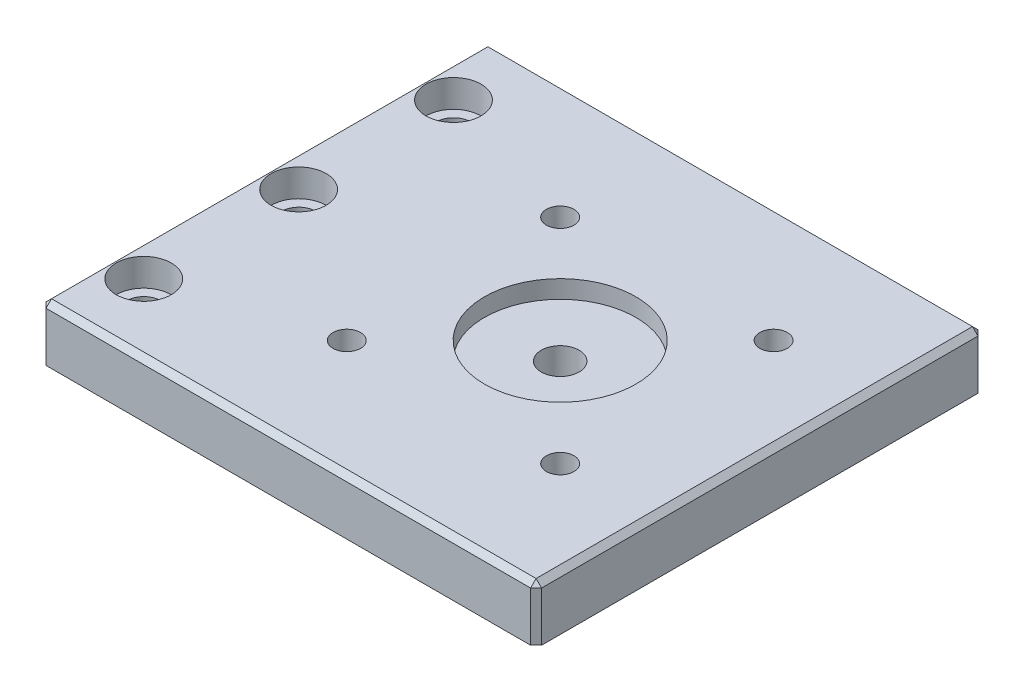
ISO-10303-21;
HEADER;
FILE_DESCRIPTION(('STEP AP214'),'2;1');
FILE_NAME('part.step','',(''),(''),'','','');
FILE_SCHEMA(('AUTOMOTIVE_DESIGN { 1 0 10303 214 1 1 1 1 }'));
ENDSEC;
DATA;
#1=APPLICATION_CONTEXT('core data for automotive mechanical design processes');
#2=APPLICATION_PROTOCOL_DEFINITION('international standard','automotive_design',2000,#1);
#3=PRODUCT_CONTEXT('',#1,'mechanical');
#4=PRODUCT('Part','Part','',(#3));
#5=PRODUCT_RELATED_PRODUCT_CATEGORY('part','',(#4));
#6=PRODUCT_DEFINITION_FORMATION('','',#4);
#7=PRODUCT_DEFINITION_CONTEXT('part definition',#1,'design');
#8=PRODUCT_DEFINITION('design','',#6,#7);
#9=PRODUCT_DEFINITION_SHAPE('','',#8);
#10=(LENGTH_UNIT() NAMED_UNIT(*) SI_UNIT(.MILLI.,.METRE.));
#11=(NAMED_UNIT(*) PLANE_ANGLE_UNIT() SI_UNIT($,.RADIAN.));
#12=(NAMED_UNIT(*) SI_UNIT($,.STERADIAN.) SOLID_ANGLE_UNIT());
#13=UNCERTAINTY_MEASURE_WITH_UNIT(LENGTH_MEASURE(1.E-05),#10,'distance_accuracy_value','');
#14=(GEOMETRIC_REPRESENTATION_CONTEXT(3) GLOBAL_UNCERTAINTY_ASSIGNED_CONTEXT((#13)) GLOBAL_UNIT_ASSIGNED_CONTEXT((#10,
#11,#12)) REPRESENTATION_CONTEXT('',''));
#15=CARTESIAN_POINT('',(0.,0.,0.));
#16=DIRECTION('',(0.,0.,1.));
#17=DIRECTION('',(1.,0.,0.));
#18=AXIS2_PLACEMENT_3D('',#15,#16,#17);
#19=CARTESIAN_POINT('',(36.,4.,-32.5));
#20=DIRECTION('',(-1.,0.,0.));
#21=DIRECTION('',(0.,0.,1.));
#22=AXIS2_PLACEMENT_3D('',#19,#20,#21);
#23=PLANE('',#22);
#24=DIRECTION('',(0.,0.,-1.));
#25=VECTOR('',#24,1.);
#26=CARTESIAN_POINT('',(36.,-4.,-32.5));
#27=LINE('',#26,#25);
#28=CARTESIAN_POINT('',(36.,-4.,31.7));
#29=VERTEX_POINT('',#28);
#30=CARTESIAN_POINT('',(36.,-4.,-31.7));
#31=VERTEX_POINT('',#30);
#32=EDGE_CURVE('E163',#29,#31,#27,.T.);
#33=ORIENTED_EDGE('',*,*,#32,.T.);
#34=DIRECTION('',(0.,1.,0.));
#35=VECTOR('',#34,1.);
#36=CARTESIAN_POINT('',(36.,4.,-31.7));
#37=LINE('',#36,#35);
#38=CARTESIAN_POINT('',(36.,3.19999999999999,-31.7));
#39=VERTEX_POINT('',#38);
#40=EDGE_CURVE('E238',#31,#39,#37,.T.);
#41=ORIENTED_EDGE('',*,*,#40,.T.);
#42=DIRECTION('',(0.,0.,1.));
#43=VECTOR('',#42,1.);
#44=CARTESIAN_POINT('',(36.,3.19999999999999,32.5));
#45=LINE('',#44,#43);
#46=CARTESIAN_POINT('',(36.,3.19999999999999,31.7));
#47=VERTEX_POINT('',#46);
#48=EDGE_CURVE('E232',#39,#47,#45,.T.);
#49=ORIENTED_EDGE('',*,*,#48,.T.);
#50=DIRECTION('',(0.,-1.,0.));
#51=VECTOR('',#50,1.);
#52=CARTESIAN_POINT('',(36.,4.,31.7));
#53=LINE('',#52,#51);
#54=EDGE_CURVE('E235',#47,#29,#53,.T.);
#55=ORIENTED_EDGE('',*,*,#54,.T.);
#56=EDGE_LOOP('',(#33,#41,#49,#55));
#57=FACE_BOUND('',#56,.T.);
#58=ADVANCED_FACE('F47',(#57),#23,.F.);
#59=CARTESIAN_POINT('',(-36.,4.,-32.5));
#60=DIRECTION('',(0.,0.,1.));
#61=DIRECTION('',(1.,0.,0.));
#62=AXIS2_PLACEMENT_3D('',#59,#60,#61);
#63=PLANE('',#62);
#64=DIRECTION('',(-1.,0.,0.));
#65=VECTOR('',#64,1.);
#66=CARTESIAN_POINT('',(-36.,-4.,-32.5));
#67=LINE('',#66,#65);
#68=CARTESIAN_POINT('',(35.2,-4.,-32.5));
#69=VERTEX_POINT('',#68);
#70=CARTESIAN_POINT('',(-35.2,-4.,-32.5));
#71=VERTEX_POINT('',#70);
#72=EDGE_CURVE('E157',#69,#71,#67,.T.);
#73=ORIENTED_EDGE('',*,*,#72,.T.);
#74=DIRECTION('',(0.,1.,0.));
#75=VECTOR('',#74,1.);
#76=CARTESIAN_POINT('',(-35.2,4.,-32.5));
#77=LINE('',#76,#75);
#78=CARTESIAN_POINT('',(-35.2,3.19999999999999,-32.5));
#79=VERTEX_POINT('',#78);
#80=EDGE_CURVE('E131',#71,#79,#77,.T.);
#81=ORIENTED_EDGE('',*,*,#80,.T.);
#82=DIRECTION('',(1.,0.,0.));
#83=VECTOR('',#82,1.);
#84=CARTESIAN_POINT('',(36.,3.19999999999999,-32.5));
#85=LINE('',#84,#83);
#86=CARTESIAN_POINT('',(35.2,3.19999999999999,-32.5));
#87=VERTEX_POINT('',#86);
#88=EDGE_CURVE('E137',#79,#87,#85,.T.);
#89=ORIENTED_EDGE('',*,*,#88,.T.);
#90=DIRECTION('',(0.,-1.,0.));
#91=VECTOR('',#90,1.);
#92=CARTESIAN_POINT('',(35.2,4.,-32.5));
#93=LINE('',#92,#91);
#94=EDGE_CURVE('E227',#87,#69,#93,.T.);
#95=ORIENTED_EDGE('',*,*,#94,.T.);
#96=EDGE_LOOP('',(#73,#81,#89,#95));
#97=FACE_BOUND('',#96,.T.);
#98=ADVANCED_FACE('F430',(#97),#63,.F.);
#99=CARTESIAN_POINT('',(-36.,4.,-32.5));
#100=DIRECTION('',(1.,0.,0.));
#101=DIRECTION('',(0.,0.,-1.));
#102=AXIS2_PLACEMENT_3D('',#99,#100,#101);
#103=PLANE('',#102);
#104=DIRECTION('',(0.,0.,-1.));
#105=VECTOR('',#104,1.);
#106=CARTESIAN_POINT('',(-36.,3.19999999999999,-32.5));
#107=LINE('',#106,#105);
#108=CARTESIAN_POINT('',(-36.,3.19999999999999,31.7));
#109=VERTEX_POINT('',#108);
#110=CARTESIAN_POINT('',(-36.,3.19999999999999,-31.7));
#111=VERTEX_POINT('',#110);
#112=EDGE_CURVE('E146',#109,#111,#107,.T.);
#113=ORIENTED_EDGE('',*,*,#112,.T.);
#114=DIRECTION('',(0.,-1.,0.));
#115=VECTOR('',#114,1.);
#116=CARTESIAN_POINT('',(-36.,4.,-31.7));
#117=LINE('',#116,#115);
#118=CARTESIAN_POINT('',(-36.,-4.,-31.7));
#119=VERTEX_POINT('',#118);
#120=EDGE_CURVE('E130',#111,#119,#117,.T.);
#121=ORIENTED_EDGE('',*,*,#120,.T.);
#122=DIRECTION('',(0.,0.,1.));
#123=VECTOR('',#122,1.);
#124=CARTESIAN_POINT('',(-36.,-4.,-32.5));
#125=LINE('',#124,#123);
#126=CARTESIAN_POINT('',(-36.,-4.,31.7));
#127=VERTEX_POINT('',#126);
#128=EDGE_CURVE('E143',#119,#127,#125,.T.);
#129=ORIENTED_EDGE('',*,*,#128,.T.);
#130=DIRECTION('',(0.,1.,0.));
#131=VECTOR('',#130,1.);
#132=CARTESIAN_POINT('',(-36.,4.,31.7));
#133=LINE('',#132,#131);
#134=EDGE_CURVE('E150',#127,#109,#133,.T.);
#135=ORIENTED_EDGE('',*,*,#134,.T.);
#136=EDGE_LOOP('',(#113,#121,#129,#135));
#137=FACE_BOUND('',#136,.T.);
#138=ADVANCED_FACE('F142',(#137),#103,.F.);
#139=CARTESIAN_POINT('',(-36.,4.,32.5));
#140=DIRECTION('',(0.,0.,-1.));
#141=DIRECTION('',(-1.,0.,0.));
#142=AXIS2_PLACEMENT_3D('',#139,#140,#141);
#143=PLANE('',#142);
#144=DIRECTION('',(1.,0.,0.));
#145=VECTOR('',#144,1.);
#146=CARTESIAN_POINT('',(-36.,-4.,32.5));
#147=LINE('',#146,#145);
#148=CARTESIAN_POINT('',(-35.2,-4.,32.5));
#149=VERTEX_POINT('',#148);
#150=CARTESIAN_POINT('',(35.2,-4.,32.5));
#151=VERTEX_POINT('',#150);
#152=EDGE_CURVE('E156',#149,#151,#147,.T.);
#153=ORIENTED_EDGE('',*,*,#152,.T.);
#154=DIRECTION('',(0.,1.,0.));
#155=VECTOR('',#154,1.);
#156=CARTESIAN_POINT('',(35.2,4.,32.5));
#157=LINE('',#156,#155);
#158=CARTESIAN_POINT('',(35.2,3.19999999999999,32.5));
#159=VERTEX_POINT('',#158);
#160=EDGE_CURVE('E247',#151,#159,#157,.T.);
#161=ORIENTED_EDGE('',*,*,#160,.T.);
#162=DIRECTION('',(-1.,0.,0.));
#163=VECTOR('',#162,1.);
#164=CARTESIAN_POINT('',(-36.,3.19999999999999,32.5));
#165=LINE('',#164,#163);
#166=CARTESIAN_POINT('',(-35.2,3.19999999999999,32.5));
#167=VERTEX_POINT('',#166);
#168=EDGE_CURVE('E241',#159,#167,#165,.T.);
#169=ORIENTED_EDGE('',*,*,#168,.T.);
#170=DIRECTION('',(0.,-1.,0.));
#171=VECTOR('',#170,1.);
#172=CARTESIAN_POINT('',(-35.2,4.,32.5));
#173=LINE('',#172,#171);
#174=EDGE_CURVE('E244',#167,#149,#173,.T.);
#175=ORIENTED_EDGE('',*,*,#174,.T.);
#176=EDGE_LOOP('',(#153,#161,#169,#175));
#177=FACE_BOUND('',#176,.T.);
#178=ADVANCED_FACE('F407',(#177),#143,.F.);
#179=CARTESIAN_POINT('',(0.,4.,0.));
#180=DIRECTION('',(0.,1.,0.));
#181=DIRECTION('',(0.,0.,1.));
#182=AXIS2_PLACEMENT_3D('',#179,#180,#181);
#183=PLANE('',#182);
#184=DIRECTION('',(-1.,0.,0.));
#185=VECTOR('',#184,1.);
#186=CARTESIAN_POINT('',(-36.,4.,-31.7));
#187=LINE('',#186,#185);
#188=CARTESIAN_POINT('',(35.2,4.,-31.7));
#189=VERTEX_POINT('',#188);
#190=CARTESIAN_POINT('',(-35.2,4.,-31.7));
#191=VERTEX_POINT('',#190);
#192=EDGE_CURVE('E58',#189,#191,#187,.T.);
#193=ORIENTED_EDGE('',*,*,#192,.T.);
#194=DIRECTION('',(0.,0.,1.));
#195=VECTOR('',#194,1.);
#196=CARTESIAN_POINT('',(-35.2,4.,32.5));
#197=LINE('',#196,#195);
#198=CARTESIAN_POINT('',(-35.2,4.,31.7));
#199=VERTEX_POINT('',#198);
#200=EDGE_CURVE('E11',#191,#199,#197,.T.);
#201=ORIENTED_EDGE('',*,*,#200,.T.);
#202=DIRECTION('',(1.,0.,0.));
#203=VECTOR('',#202,1.);
#204=CARTESIAN_POINT('',(36.,4.,31.7));
#205=LINE('',#204,#203);
#206=CARTESIAN_POINT('',(35.2,4.,31.7));
#207=VERTEX_POINT('',#206);
#208=EDGE_CURVE('E250',#199,#207,#205,.T.);
#209=ORIENTED_EDGE('',*,*,#208,.T.);
#210=DIRECTION('',(0.,0.,-1.));
#211=VECTOR('',#210,1.);
#212=CARTESIAN_POINT('',(35.2,4.,-32.5));
#213=LINE('',#212,#211);
#214=EDGE_CURVE('E69',#207,#189,#213,.T.);
#215=ORIENTED_EDGE('',*,*,#214,.T.);
#216=EDGE_LOOP('',(#193,#201,#209,#215));
#217=FACE_BOUND('',#216,.T.);
#218=CARTESIAN_POINT('',(-31.,4.,-22.5));
#219=DIRECTION('',(0.,1.,0.));
#220=DIRECTION('',(0.,0.,1.));
#221=AXIS2_PLACEMENT_3D('',#218,#219,#220);
#222=CIRCLE('',#221,4.00000000000001);
#223=CARTESIAN_POINT('',(-31.,4.,-18.5));
#224=VERTEX_POINT('',#223);
#225=EDGE_CURVE('E302',#224,#224,#222,.T.);
#226=ORIENTED_EDGE('',*,*,#225,.F.);
#227=EDGE_LOOP('',(#226));
#228=FACE_BOUND('',#227,.T.);
#229=CARTESIAN_POINT('',(-31.,4.,0.));
#230=DIRECTION('',(0.,1.,0.));
#231=DIRECTION('',(0.,0.,1.));
#232=AXIS2_PLACEMENT_3D('',#229,#230,#231);
#233=CIRCLE('',#232,4.00000000000001);
#234=CARTESIAN_POINT('',(-31.,4.,4.00000000000001));
#235=VERTEX_POINT('',#234);
#236=EDGE_CURVE('E212',#235,#235,#233,.T.);
#237=ORIENTED_EDGE('',*,*,#236,.F.);
#238=EDGE_LOOP('',(#237));
#239=FACE_BOUND('',#238,.T.);
#240=CARTESIAN_POINT('',(-31.,4.,22.5));
#241=DIRECTION('',(0.,1.,0.));
#242=DIRECTION('',(0.,0.,1.));
#243=AXIS2_PLACEMENT_3D('',#240,#241,#242);
#244=CIRCLE('',#243,4.00000000000001);
#245=CARTESIAN_POINT('',(-31.,4.,26.5));
#246=VERTEX_POINT('',#245);
#247=EDGE_CURVE('E206',#246,#246,#244,.T.);
#248=ORIENTED_EDGE('',*,*,#247,.F.);
#249=EDGE_LOOP('',(#248));
#250=FACE_BOUND('',#249,.T.);
#251=CARTESIAN_POINT('',(22.5,4.,-15.5));
#252=DIRECTION('',(0.,1.,0.));
#253=DIRECTION('',(0.,0.,1.));
#254=AXIS2_PLACEMENT_3D('',#251,#252,#253);
#255=CIRCLE('',#254,2.00000000000001);
#256=CARTESIAN_POINT('',(22.5,4.,-13.5));
#257=VERTEX_POINT('',#256);
#258=EDGE_CURVE('E190',#257,#257,#255,.T.);
#259=ORIENTED_EDGE('',*,*,#258,.F.);
#260=EDGE_LOOP('',(#259));
#261=FACE_BOUND('',#260,.T.);
#262=CARTESIAN_POINT('',(-8.5,4.,-15.5));
#263=DIRECTION('',(0.,1.,0.));
#264=DIRECTION('',(0.,0.,1.));
#265=AXIS2_PLACEMENT_3D('',#262,#263,#264);
#266=CIRCLE('',#265,2.00000000000001);
#267=CARTESIAN_POINT('',(-8.5,4.,-13.5));
#268=VERTEX_POINT('',#267);
#269=EDGE_CURVE('E184',#268,#268,#266,.T.);
#270=ORIENTED_EDGE('',*,*,#269,.F.);
#271=EDGE_LOOP('',(#270));
#272=FACE_BOUND('',#271,.T.);
#273=CARTESIAN_POINT('',(-8.5,4.,15.5));
#274=DIRECTION('',(0.,1.,0.));
#275=DIRECTION('',(0.,0.,1.));
#276=AXIS2_PLACEMENT_3D('',#273,#274,#275);
#277=CIRCLE('',#276,2.00000000000001);
#278=CARTESIAN_POINT('',(-8.5,4.,17.5));
#279=VERTEX_POINT('',#278);
#280=EDGE_CURVE('E178',#279,#279,#277,.T.);
#281=ORIENTED_EDGE('',*,*,#280,.F.);
#282=EDGE_LOOP('',(#281));
#283=FACE_BOUND('',#282,.T.);
#284=CARTESIAN_POINT('',(22.5,4.,15.5));
#285=DIRECTION('',(0.,1.,0.));
#286=DIRECTION('',(0.,0.,1.));
#287=AXIS2_PLACEMENT_3D('',#284,#285,#286);
#288=CIRCLE('',#287,2.00000000000001);
#289=CARTESIAN_POINT('',(22.5,4.,17.5));
#290=VERTEX_POINT('',#289);
#291=EDGE_CURVE('E172',#290,#290,#288,.T.);
#292=ORIENTED_EDGE('',*,*,#291,.F.);
#293=EDGE_LOOP('',(#292));
#294=FACE_BOUND('',#293,.T.);
#295=CARTESIAN_POINT('',(7.,4.,0.));
#296=DIRECTION('',(0.,1.,0.));
#297=DIRECTION('',(0.,0.,1.));
#298=AXIS2_PLACEMENT_3D('',#295,#296,#297);
#299=CIRCLE('',#298,11.);
#300=CARTESIAN_POINT('',(7.,4.,11.));
#301=VERTEX_POINT('',#300);
#302=EDGE_CURVE('E176',#301,#301,#299,.T.);
#303=ORIENTED_EDGE('',*,*,#302,.F.);
#304=EDGE_LOOP('',(#303));
#305=FACE_BOUND('',#304,.T.);
#306=ADVANCED_FACE('F601',(#217,#228,#239,#250,#261,#272,#283,#294,#305),#183,.T.);
#307=CARTESIAN_POINT('',(0.,-4.,0.));
#308=DIRECTION('',(0.,1.,0.));
#309=DIRECTION('',(0.,0.,1.));
#310=AXIS2_PLACEMENT_3D('',#307,#308,#309);
#311=PLANE('',#310);
#312=CARTESIAN_POINT('',(-31.,-4.,-22.5));
#313=DIRECTION('',(0.,1.,0.));
#314=DIRECTION('',(0.,0.,1.));
#315=AXIS2_PLACEMENT_3D('',#312,#313,#314);
#316=CIRCLE('',#315,2.50000000000001);
#317=CARTESIAN_POINT('',(-31.,-4.,-20.));
#318=VERTEX_POINT('',#317);
#319=EDGE_CURVE('E208',#318,#318,#316,.T.);
#320=ORIENTED_EDGE('',*,*,#319,.T.);
#321=EDGE_LOOP('',(#320));
#322=FACE_BOUND('',#321,.T.);
#323=CARTESIAN_POINT('',(-31.,-4.,0.));
#324=DIRECTION('',(0.,1.,0.));
#325=DIRECTION('',(0.,0.,1.));
#326=AXIS2_PLACEMENT_3D('',#323,#324,#325);
#327=CIRCLE('',#326,2.50000000000001);
#328=CARTESIAN_POINT('',(-31.,-4.,2.50000000000001));
#329=VERTEX_POINT('',#328);
#330=EDGE_CURVE('E202',#329,#329,#327,.T.);
#331=ORIENTED_EDGE('',*,*,#330,.T.);
#332=EDGE_LOOP('',(#331));
#333=FACE_BOUND('',#332,.T.);
#334=CARTESIAN_POINT('',(-31.,-4.,22.5));
#335=DIRECTION('',(0.,1.,0.));
#336=DIRECTION('',(0.,0.,1.));
#337=AXIS2_PLACEMENT_3D('',#334,#335,#336);
#338=CIRCLE('',#337,2.50000000000001);
#339=CARTESIAN_POINT('',(-31.,-4.,25.));
#340=VERTEX_POINT('',#339);
#341=EDGE_CURVE('E196',#340,#340,#338,.T.);
#342=ORIENTED_EDGE('',*,*,#341,.T.);
#343=EDGE_LOOP('',(#342));
#344=FACE_BOUND('',#343,.T.);
#345=CARTESIAN_POINT('',(22.5,-4.,-15.5));
#346=DIRECTION('',(0.,-1.,0.));
#347=DIRECTION('',(0.,0.,-1.));
#348=AXIS2_PLACEMENT_3D('',#345,#346,#347);
#349=CIRCLE('',#348,3.00000000000002);
#350=CARTESIAN_POINT('',(22.5,-4.,-18.5));
#351=VERTEX_POINT('',#350);
#352=EDGE_CURVE('E200',#351,#351,#349,.T.);
#353=ORIENTED_EDGE('',*,*,#352,.F.);
#354=EDGE_LOOP('',(#353));
#355=FACE_BOUND('',#354,.T.);
#356=CARTESIAN_POINT('',(-8.5,-4.,-15.5));
#357=DIRECTION('',(0.,-1.,0.));
#358=DIRECTION('',(0.,0.,-1.));
#359=AXIS2_PLACEMENT_3D('',#356,#357,#358);
#360=CIRCLE('',#359,3.00000000000001);
#361=CARTESIAN_POINT('',(-8.5,-4.,-18.5));
#362=VERTEX_POINT('',#361);
#363=EDGE_CURVE('E194',#362,#362,#360,.T.);
#364=ORIENTED_EDGE('',*,*,#363,.F.);
#365=EDGE_LOOP('',(#364));
#366=FACE_BOUND('',#365,.T.);
#367=CARTESIAN_POINT('',(-8.5,-4.,15.5));
#368=DIRECTION('',(0.,-1.,0.));
#369=DIRECTION('',(0.,0.,-1.));
#370=AXIS2_PLACEMENT_3D('',#367,#368,#369);
#371=CIRCLE('',#370,3.00000000000001);
#372=CARTESIAN_POINT('',(-8.5,-4.,12.5));
#373=VERTEX_POINT('',#372);
#374=EDGE_CURVE('E188',#373,#373,#371,.T.);
#375=ORIENTED_EDGE('',*,*,#374,.F.);
#376=EDGE_LOOP('',(#375));
#377=FACE_BOUND('',#376,.T.);
#378=CARTESIAN_POINT('',(22.5,-4.,15.5));
#379=DIRECTION('',(0.,-1.,0.));
#380=DIRECTION('',(0.,0.,-1.));
#381=AXIS2_PLACEMENT_3D('',#378,#379,#380);
#382=CIRCLE('',#381,3.00000000000002);
#383=CARTESIAN_POINT('',(22.5,-4.,12.5));
#384=VERTEX_POINT('',#383);
#385=EDGE_CURVE('E182',#384,#384,#382,.T.);
#386=ORIENTED_EDGE('',*,*,#385,.F.);
#387=EDGE_LOOP('',(#386));
#388=FACE_BOUND('',#387,.T.);
#389=CARTESIAN_POINT('',(7.,-4.,0.));
#390=DIRECTION('',(0.,1.,0.));
#391=DIRECTION('',(0.,0.,1.));
#392=AXIS2_PLACEMENT_3D('',#389,#390,#391);
#393=CIRCLE('',#392,2.75000000000001);
#394=CARTESIAN_POINT('',(7.,-4.,2.75000000000002));
#395=VERTEX_POINT('',#394);
#396=EDGE_CURVE('E167',#395,#395,#393,.T.);
#397=ORIENTED_EDGE('',*,*,#396,.T.);
#398=EDGE_LOOP('',(#397));
#399=FACE_BOUND('',#398,.T.);
#400=ORIENTED_EDGE('',*,*,#128,.F.);
#401=DIRECTION('',(-0.707106781186548,0.,0.707106781186548));
#402=VECTOR('',#401,1.);
#403=CARTESIAN_POINT('',(-36.,-4.,-31.7));
#404=LINE('',#403,#402);
#405=EDGE_CURVE('E126',#119,#71,#404,.F.);
#406=ORIENTED_EDGE('',*,*,#405,.T.);
#407=ORIENTED_EDGE('',*,*,#72,.F.);
#408=DIRECTION('',(-0.707106781186548,0.,-0.707106781186548));
#409=VECTOR('',#408,1.);
#410=CARTESIAN_POINT('',(35.2,-4.,-32.5));
#411=LINE('',#410,#409);
#412=EDGE_CURVE('E138',#69,#31,#411,.F.);
#413=ORIENTED_EDGE('',*,*,#412,.T.);
#414=ORIENTED_EDGE('',*,*,#32,.F.);
#415=DIRECTION('',(0.707106781186548,0.,-0.707106781186548));
#416=VECTOR('',#415,1.);
#417=CARTESIAN_POINT('',(36.,-4.,31.7));
#418=LINE('',#417,#416);
#419=EDGE_CURVE('E220',#29,#151,#418,.F.);
#420=ORIENTED_EDGE('',*,*,#419,.T.);
#421=ORIENTED_EDGE('',*,*,#152,.F.);
#422=DIRECTION('',(0.707106781186548,0.,0.707106781186548));
#423=VECTOR('',#422,1.);
#424=CARTESIAN_POINT('',(-35.2,-4.,32.5));
#425=LINE('',#424,#423);
#426=EDGE_CURVE('E149',#149,#127,#425,.F.);
#427=ORIENTED_EDGE('',*,*,#426,.T.);
#428=EDGE_LOOP('',(#400,#406,#407,#413,#414,#420,#421,#427));
#429=FACE_BOUND('',#428,.T.);
#430=ADVANCED_FACE('F152',(#322,#333,#344,#355,#366,#377,#388,#399,#429),#311,.F.);
#431=CARTESIAN_POINT('',(7.,4.,0.));
#432=DIRECTION('',(0.,1.,0.));
#433=DIRECTION('',(0.,0.,1.));
#434=AXIS2_PLACEMENT_3D('',#431,#432,#433);
#435=CYLINDRICAL_SURFACE('',#434,2.75000000000001);
#436=CARTESIAN_POINT('',(7.,1.4,0.));
#437=DIRECTION('',(0.,1.,0.));
#438=DIRECTION('',(0.,0.,1.));
#439=AXIS2_PLACEMENT_3D('',#436,#437,#438);
#440=CIRCLE('',#439,2.75000000000001);
#441=CARTESIAN_POINT('',(7.,1.4,2.75000000000003));
#442=VERTEX_POINT('',#441);
#443=EDGE_CURVE('E171',#442,#442,#440,.T.);
#444=ORIENTED_EDGE('',*,*,#443,.T.);
#445=EDGE_LOOP('',(#444));
#446=FACE_BOUND('',#445,.T.);
#447=ORIENTED_EDGE('',*,*,#396,.F.);
#448=EDGE_LOOP('',(#447));
#449=FACE_BOUND('',#448,.T.);
#450=ADVANCED_FACE('F596',(#446,#449),#435,.F.);
#451=CARTESIAN_POINT('',(9.75000000000001,1.4,0.));
#452=DIRECTION('',(0.,-1.,0.));
#453=DIRECTION('',(0.,0.,-1.));
#454=AXIS2_PLACEMENT_3D('',#451,#452,#453);
#455=PLANE('',#454);
#456=ORIENTED_EDGE('',*,*,#443,.F.);
#457=EDGE_LOOP('',(#456));
#458=FACE_BOUND('',#457,.T.);
#459=CARTESIAN_POINT('',(7.,1.4,0.));
#460=DIRECTION('',(0.,1.,0.));
#461=DIRECTION('',(0.,0.,1.));
#462=AXIS2_PLACEMENT_3D('',#459,#460,#461);
#463=CIRCLE('',#462,11.);
#464=CARTESIAN_POINT('',(7.,1.4,11.));
#465=VERTEX_POINT('',#464);
#466=EDGE_CURVE('E382',#465,#465,#463,.T.);
#467=ORIENTED_EDGE('',*,*,#466,.T.);
#468=EDGE_LOOP('',(#467));
#469=FACE_BOUND('',#468,.T.);
#470=ADVANCED_FACE('F592',(#458,#469),#455,.F.);
#471=CARTESIAN_POINT('',(7.,4.,0.));
#472=DIRECTION('',(0.,1.,0.));
#473=DIRECTION('',(0.,0.,1.));
#474=AXIS2_PLACEMENT_3D('',#471,#472,#473);
#475=CYLINDRICAL_SURFACE('',#474,11.);
#476=ORIENTED_EDGE('',*,*,#466,.F.);
#477=EDGE_LOOP('',(#476));
#478=FACE_BOUND('',#477,.T.);
#479=ORIENTED_EDGE('',*,*,#302,.T.);
#480=EDGE_LOOP('',(#479));
#481=FACE_BOUND('',#480,.T.);
#482=ADVANCED_FACE('F588',(#478,#481),#475,.F.);
#483=CARTESIAN_POINT('',(22.5,-4.,15.5));
#484=DIRECTION('',(0.,-1.,0.));
#485=DIRECTION('',(0.,0.,-1.));
#486=AXIS2_PLACEMENT_3D('',#483,#484,#485);
#487=CYLINDRICAL_SURFACE('',#486,2.00000000000001);
#488=ORIENTED_EDGE('',*,*,#291,.T.);
#489=EDGE_LOOP('',(#488));
#490=FACE_BOUND('',#489,.T.);
#491=CARTESIAN_POINT('',(22.5,-1.,15.5));
#492=DIRECTION('',(0.,-1.,0.));
#493=DIRECTION('',(0.,0.,-1.));
#494=AXIS2_PLACEMENT_3D('',#491,#492,#493);
#495=CIRCLE('',#494,2.00000000000001);
#496=CARTESIAN_POINT('',(22.5,-1.,13.5));
#497=VERTEX_POINT('',#496);
#498=EDGE_CURVE('E177',#497,#497,#495,.T.);
#499=ORIENTED_EDGE('',*,*,#498,.T.);
#500=EDGE_LOOP('',(#499));
#501=FACE_BOUND('',#500,.T.);
#502=ADVANCED_FACE('F584',(#490,#501),#487,.F.);
#503=CARTESIAN_POINT('',(24.5,-1.,15.5));
#504=DIRECTION('',(0.,1.,0.));
#505=DIRECTION('',(0.,0.,1.));
#506=AXIS2_PLACEMENT_3D('',#503,#504,#505);
#507=PLANE('',#506);
#508=ORIENTED_EDGE('',*,*,#498,.F.);
#509=EDGE_LOOP('',(#508));
#510=FACE_BOUND('',#509,.T.);
#511=CARTESIAN_POINT('',(22.5,-1.,15.5));
#512=DIRECTION('',(0.,-1.,0.));
#513=DIRECTION('',(0.,0.,-1.));
#514=AXIS2_PLACEMENT_3D('',#511,#512,#513);
#515=CIRCLE('',#514,3.00000000000001);
#516=CARTESIAN_POINT('',(22.5,-1.,12.5));
#517=VERTEX_POINT('',#516);
#518=EDGE_CURVE('E372',#517,#517,#515,.T.);
#519=ORIENTED_EDGE('',*,*,#518,.T.);
#520=EDGE_LOOP('',(#519));
#521=FACE_BOUND('',#520,.T.);
#522=ADVANCED_FACE('F580',(#510,#521),#507,.F.);
#523=CARTESIAN_POINT('',(22.5,-4.,15.5));
#524=DIRECTION('',(0.,-1.,0.));
#525=DIRECTION('',(0.,0.,-1.));
#526=AXIS2_PLACEMENT_3D('',#523,#524,#525);
#527=CYLINDRICAL_SURFACE('',#526,3.00000000000001);
#528=ORIENTED_EDGE('',*,*,#518,.F.);
#529=EDGE_LOOP('',(#528));
#530=FACE_BOUND('',#529,.T.);
#531=ORIENTED_EDGE('',*,*,#385,.T.);
#532=EDGE_LOOP('',(#531));
#533=FACE_BOUND('',#532,.T.);
#534=ADVANCED_FACE('F576',(#530,#533),#527,.F.);
#535=CARTESIAN_POINT('',(-8.5,-4.,15.5));
#536=DIRECTION('',(0.,-1.,0.));
#537=DIRECTION('',(0.,0.,-1.));
#538=AXIS2_PLACEMENT_3D('',#535,#536,#537);
#539=CYLINDRICAL_SURFACE('',#538,2.00000000000001);
#540=ORIENTED_EDGE('',*,*,#280,.T.);
#541=EDGE_LOOP('',(#540));
#542=FACE_BOUND('',#541,.T.);
#543=CARTESIAN_POINT('',(-8.5,-1.,15.5));
#544=DIRECTION('',(0.,-1.,0.));
#545=DIRECTION('',(0.,0.,-1.));
#546=AXIS2_PLACEMENT_3D('',#543,#544,#545);
#547=CIRCLE('',#546,2.00000000000001);
#548=CARTESIAN_POINT('',(-8.5,-1.,13.5));
#549=VERTEX_POINT('',#548);
#550=EDGE_CURVE('E183',#549,#549,#547,.T.);
#551=ORIENTED_EDGE('',*,*,#550,.T.);
#552=EDGE_LOOP('',(#551));
#553=FACE_BOUND('',#552,.T.);
#554=ADVANCED_FACE('F572',(#542,#553),#539,.F.);
#555=CARTESIAN_POINT('',(-6.49999999999999,-1.,15.5));
#556=DIRECTION('',(0.,1.,0.));
#557=DIRECTION('',(0.,0.,1.));
#558=AXIS2_PLACEMENT_3D('',#555,#556,#557);
#559=PLANE('',#558);
#560=ORIENTED_EDGE('',*,*,#550,.F.);
#561=EDGE_LOOP('',(#560));
#562=FACE_BOUND('',#561,.T.);
#563=CARTESIAN_POINT('',(-8.5,-1.,15.5));
#564=DIRECTION('',(0.,-1.,0.));
#565=DIRECTION('',(0.,0.,-1.));
#566=AXIS2_PLACEMENT_3D('',#563,#564,#565);
#567=CIRCLE('',#566,3.00000000000001);
#568=CARTESIAN_POINT('',(-8.5,-1.,12.5));
#569=VERTEX_POINT('',#568);
#570=EDGE_CURVE('E362',#569,#569,#567,.T.);
#571=ORIENTED_EDGE('',*,*,#570,.T.);
#572=EDGE_LOOP('',(#571));
#573=FACE_BOUND('',#572,.T.);
#574=ADVANCED_FACE('F568',(#562,#573),#559,.F.);
#575=CARTESIAN_POINT('',(-8.5,-4.,15.5));
#576=DIRECTION('',(0.,-1.,0.));
#577=DIRECTION('',(0.,0.,-1.));
#578=AXIS2_PLACEMENT_3D('',#575,#576,#577);
#579=CYLINDRICAL_SURFACE('',#578,3.00000000000001);
#580=ORIENTED_EDGE('',*,*,#570,.F.);
#581=EDGE_LOOP('',(#580));
#582=FACE_BOUND('',#581,.T.);
#583=ORIENTED_EDGE('',*,*,#374,.T.);
#584=EDGE_LOOP('',(#583));
#585=FACE_BOUND('',#584,.T.);
#586=ADVANCED_FACE('F564',(#582,#585),#579,.F.);
#587=CARTESIAN_POINT('',(-8.5,-4.,-15.5));
#588=DIRECTION('',(0.,-1.,0.));
#589=DIRECTION('',(0.,0.,-1.));
#590=AXIS2_PLACEMENT_3D('',#587,#588,#589);
#591=CYLINDRICAL_SURFACE('',#590,2.00000000000001);
#592=ORIENTED_EDGE('',*,*,#269,.T.);
#593=EDGE_LOOP('',(#592));
#594=FACE_BOUND('',#593,.T.);
#595=CARTESIAN_POINT('',(-8.5,-1.,-15.5));
#596=DIRECTION('',(0.,-1.,0.));
#597=DIRECTION('',(0.,0.,-1.));
#598=AXIS2_PLACEMENT_3D('',#595,#596,#597);
#599=CIRCLE('',#598,2.00000000000001);
#600=CARTESIAN_POINT('',(-8.5,-1.,-17.5));
#601=VERTEX_POINT('',#600);
#602=EDGE_CURVE('E189',#601,#601,#599,.T.);
#603=ORIENTED_EDGE('',*,*,#602,.T.);
#604=EDGE_LOOP('',(#603));
#605=FACE_BOUND('',#604,.T.);
#606=ADVANCED_FACE('F560',(#594,#605),#591,.F.);
#607=CARTESIAN_POINT('',(-6.49999999999999,-1.,-15.5));
#608=DIRECTION('',(0.,1.,0.));
#609=DIRECTION('',(0.,0.,1.));
#610=AXIS2_PLACEMENT_3D('',#607,#608,#609);
#611=PLANE('',#610);
#612=ORIENTED_EDGE('',*,*,#602,.F.);
#613=EDGE_LOOP('',(#612));
#614=FACE_BOUND('',#613,.T.);
#615=CARTESIAN_POINT('',(-8.5,-1.,-15.5));
#616=DIRECTION('',(0.,-1.,0.));
#617=DIRECTION('',(0.,0.,-1.));
#618=AXIS2_PLACEMENT_3D('',#615,#616,#617);
#619=CIRCLE('',#618,3.00000000000001);
#620=CARTESIAN_POINT('',(-8.5,-1.,-18.5));
#621=VERTEX_POINT('',#620);
#622=EDGE_CURVE('E352',#621,#621,#619,.T.);
#623=ORIENTED_EDGE('',*,*,#622,.T.);
#624=EDGE_LOOP('',(#623));
#625=FACE_BOUND('',#624,.T.);
#626=ADVANCED_FACE('F556',(#614,#625),#611,.F.);
#627=CARTESIAN_POINT('',(-8.5,-4.,-15.5));
#628=DIRECTION('',(0.,-1.,0.));
#629=DIRECTION('',(0.,0.,-1.));
#630=AXIS2_PLACEMENT_3D('',#627,#628,#629);
#631=CYLINDRICAL_SURFACE('',#630,3.00000000000001);
#632=ORIENTED_EDGE('',*,*,#622,.F.);
#633=EDGE_LOOP('',(#632));
#634=FACE_BOUND('',#633,.T.);
#635=ORIENTED_EDGE('',*,*,#363,.T.);
#636=EDGE_LOOP('',(#635));
#637=FACE_BOUND('',#636,.T.);
#638=ADVANCED_FACE('F552',(#634,#637),#631,.F.);
#639=CARTESIAN_POINT('',(22.5,-4.,-15.5));
#640=DIRECTION('',(0.,-1.,0.));
#641=DIRECTION('',(0.,0.,-1.));
#642=AXIS2_PLACEMENT_3D('',#639,#640,#641);
#643=CYLINDRICAL_SURFACE('',#642,2.00000000000001);
#644=ORIENTED_EDGE('',*,*,#258,.T.);
#645=EDGE_LOOP('',(#644));
#646=FACE_BOUND('',#645,.T.);
#647=CARTESIAN_POINT('',(22.5,-1.,-15.5));
#648=DIRECTION('',(0.,-1.,0.));
#649=DIRECTION('',(0.,0.,-1.));
#650=AXIS2_PLACEMENT_3D('',#647,#648,#649);
#651=CIRCLE('',#650,2.00000000000001);
#652=CARTESIAN_POINT('',(22.5,-1.,-17.5));
#653=VERTEX_POINT('',#652);
#654=EDGE_CURVE('E195',#653,#653,#651,.T.);
#655=ORIENTED_EDGE('',*,*,#654,.T.);
#656=EDGE_LOOP('',(#655));
#657=FACE_BOUND('',#656,.T.);
#658=ADVANCED_FACE('F548',(#646,#657),#643,.F.);
#659=CARTESIAN_POINT('',(24.5,-1.,-15.5));
#660=DIRECTION('',(0.,1.,0.));
#661=DIRECTION('',(0.,0.,1.));
#662=AXIS2_PLACEMENT_3D('',#659,#660,#661);
#663=PLANE('',#662);
#664=ORIENTED_EDGE('',*,*,#654,.F.);
#665=EDGE_LOOP('',(#664));
#666=FACE_BOUND('',#665,.T.);
#667=CARTESIAN_POINT('',(22.5,-1.,-15.5));
#668=DIRECTION('',(0.,-1.,0.));
#669=DIRECTION('',(0.,0.,-1.));
#670=AXIS2_PLACEMENT_3D('',#667,#668,#669);
#671=CIRCLE('',#670,3.00000000000001);
#672=CARTESIAN_POINT('',(22.5,-1.,-18.5));
#673=VERTEX_POINT('',#672);
#674=EDGE_CURVE('E342',#673,#673,#671,.T.);
#675=ORIENTED_EDGE('',*,*,#674,.T.);
#676=EDGE_LOOP('',(#675));
#677=FACE_BOUND('',#676,.T.);
#678=ADVANCED_FACE('F544',(#666,#677),#663,.F.);
#679=CARTESIAN_POINT('',(22.5,-4.,-15.5));
#680=DIRECTION('',(0.,-1.,0.));
#681=DIRECTION('',(0.,0.,-1.));
#682=AXIS2_PLACEMENT_3D('',#679,#680,#681);
#683=CYLINDRICAL_SURFACE('',#682,3.00000000000001);
#684=ORIENTED_EDGE('',*,*,#674,.F.);
#685=EDGE_LOOP('',(#684));
#686=FACE_BOUND('',#685,.T.);
#687=ORIENTED_EDGE('',*,*,#352,.T.);
#688=EDGE_LOOP('',(#687));
#689=FACE_BOUND('',#688,.T.);
#690=ADVANCED_FACE('F540',(#686,#689),#683,.F.);
#691=CARTESIAN_POINT('',(-31.,4.,22.5));
#692=DIRECTION('',(0.,1.,0.));
#693=DIRECTION('',(0.,0.,1.));
#694=AXIS2_PLACEMENT_3D('',#691,#692,#693);
#695=CYLINDRICAL_SURFACE('',#694,2.50000000000001);
#696=CARTESIAN_POINT('',(-31.,0.,22.5));
#697=DIRECTION('',(0.,1.,0.));
#698=DIRECTION('',(0.,0.,1.));
#699=AXIS2_PLACEMENT_3D('',#696,#697,#698);
#700=CIRCLE('',#699,2.50000000000001);
#701=CARTESIAN_POINT('',(-31.,0.,25.));
#702=VERTEX_POINT('',#701);
#703=EDGE_CURVE('E201',#702,#702,#700,.T.);
#704=ORIENTED_EDGE('',*,*,#703,.T.);
#705=EDGE_LOOP('',(#704));
#706=FACE_BOUND('',#705,.T.);
#707=ORIENTED_EDGE('',*,*,#341,.F.);
#708=EDGE_LOOP('',(#707));
#709=FACE_BOUND('',#708,.T.);
#710=ADVANCED_FACE('F536',(#706,#709),#695,.F.);
#711=CARTESIAN_POINT('',(-28.5,0.,22.5));
#712=DIRECTION('',(0.,-1.,0.));
#713=DIRECTION('',(0.,0.,-1.));
#714=AXIS2_PLACEMENT_3D('',#711,#712,#713);
#715=PLANE('',#714);
#716=ORIENTED_EDGE('',*,*,#703,.F.);
#717=EDGE_LOOP('',(#716));
#718=FACE_BOUND('',#717,.T.);
#719=CARTESIAN_POINT('',(-31.,0.,22.5));
#720=DIRECTION('',(0.,1.,0.));
#721=DIRECTION('',(0.,0.,1.));
#722=AXIS2_PLACEMENT_3D('',#719,#720,#721);
#723=CIRCLE('',#722,4.00000000000001);
#724=CARTESIAN_POINT('',(-31.,0.,26.5));
#725=VERTEX_POINT('',#724);
#726=EDGE_CURVE('E332',#725,#725,#723,.T.);
#727=ORIENTED_EDGE('',*,*,#726,.T.);
#728=EDGE_LOOP('',(#727));
#729=FACE_BOUND('',#728,.T.);
#730=ADVANCED_FACE('F532',(#718,#729),#715,.F.);
#731=CARTESIAN_POINT('',(-31.,4.,22.5));
#732=DIRECTION('',(0.,1.,0.));
#733=DIRECTION('',(0.,0.,1.));
#734=AXIS2_PLACEMENT_3D('',#731,#732,#733);
#735=CYLINDRICAL_SURFACE('',#734,4.00000000000001);
#736=ORIENTED_EDGE('',*,*,#726,.F.);
#737=EDGE_LOOP('',(#736));
#738=FACE_BOUND('',#737,.T.);
#739=ORIENTED_EDGE('',*,*,#247,.T.);
#740=EDGE_LOOP('',(#739));
#741=FACE_BOUND('',#740,.T.);
#742=ADVANCED_FACE('F528',(#738,#741),#735,.F.);
#743=CARTESIAN_POINT('',(-31.,4.,0.));
#744=DIRECTION('',(0.,1.,0.));
#745=DIRECTION('',(0.,0.,1.));
#746=AXIS2_PLACEMENT_3D('',#743,#744,#745);
#747=CYLINDRICAL_SURFACE('',#746,2.50000000000001);
#748=CARTESIAN_POINT('',(-31.,0.,0.));
#749=DIRECTION('',(0.,1.,0.));
#750=DIRECTION('',(0.,0.,1.));
#751=AXIS2_PLACEMENT_3D('',#748,#749,#750);
#752=CIRCLE('',#751,2.50000000000001);
#753=CARTESIAN_POINT('',(-31.,0.,2.50000000000001));
#754=VERTEX_POINT('',#753);
#755=EDGE_CURVE('E207',#754,#754,#752,.T.);
#756=ORIENTED_EDGE('',*,*,#755,.T.);
#757=EDGE_LOOP('',(#756));
#758=FACE_BOUND('',#757,.T.);
#759=ORIENTED_EDGE('',*,*,#330,.F.);
#760=EDGE_LOOP('',(#759));
#761=FACE_BOUND('',#760,.T.);
#762=ADVANCED_FACE('F524',(#758,#761),#747,.F.);
#763=CARTESIAN_POINT('',(-28.5,0.,0.));
#764=DIRECTION('',(0.,-1.,0.));
#765=DIRECTION('',(0.,0.,-1.));
#766=AXIS2_PLACEMENT_3D('',#763,#764,#765);
#767=PLANE('',#766);
#768=ORIENTED_EDGE('',*,*,#755,.F.);
#769=EDGE_LOOP('',(#768));
#770=FACE_BOUND('',#769,.T.);
#771=CARTESIAN_POINT('',(-31.,0.,0.));
#772=DIRECTION('',(0.,1.,0.));
#773=DIRECTION('',(0.,0.,1.));
#774=AXIS2_PLACEMENT_3D('',#771,#772,#773);
#775=CIRCLE('',#774,4.00000000000001);
#776=CARTESIAN_POINT('',(-31.,0.,4.00000000000001));
#777=VERTEX_POINT('',#776);
#778=EDGE_CURVE('E322',#777,#777,#775,.T.);
#779=ORIENTED_EDGE('',*,*,#778,.T.);
#780=EDGE_LOOP('',(#779));
#781=FACE_BOUND('',#780,.T.);
#782=ADVANCED_FACE('F520',(#770,#781),#767,.F.);
#783=CARTESIAN_POINT('',(-31.,4.,0.));
#784=DIRECTION('',(0.,1.,0.));
#785=DIRECTION('',(0.,0.,1.));
#786=AXIS2_PLACEMENT_3D('',#783,#784,#785);
#787=CYLINDRICAL_SURFACE('',#786,4.00000000000001);
#788=ORIENTED_EDGE('',*,*,#778,.F.);
#789=EDGE_LOOP('',(#788));
#790=FACE_BOUND('',#789,.T.);
#791=ORIENTED_EDGE('',*,*,#236,.T.);
#792=EDGE_LOOP('',(#791));
#793=FACE_BOUND('',#792,.T.);
#794=ADVANCED_FACE('F516',(#790,#793),#787,.F.);
#795=CARTESIAN_POINT('',(-31.,4.,-22.5));
#796=DIRECTION('',(0.,1.,0.));
#797=DIRECTION('',(0.,0.,1.));
#798=AXIS2_PLACEMENT_3D('',#795,#796,#797);
#799=CYLINDRICAL_SURFACE('',#798,2.50000000000001);
#800=CARTESIAN_POINT('',(-31.,0.,-22.5));
#801=DIRECTION('',(0.,1.,0.));
#802=DIRECTION('',(0.,0.,1.));
#803=AXIS2_PLACEMENT_3D('',#800,#801,#802);
#804=CIRCLE('',#803,2.50000000000001);
#805=CARTESIAN_POINT('',(-31.,0.,-20.));
#806=VERTEX_POINT('',#805);
#807=EDGE_CURVE('E213',#806,#806,#804,.T.);
#808=ORIENTED_EDGE('',*,*,#807,.T.);
#809=EDGE_LOOP('',(#808));
#810=FACE_BOUND('',#809,.T.);
#811=ORIENTED_EDGE('',*,*,#319,.F.);
#812=EDGE_LOOP('',(#811));
#813=FACE_BOUND('',#812,.T.);
#814=ADVANCED_FACE('F509',(#810,#813),#799,.F.);
#815=CARTESIAN_POINT('',(-28.5,0.,-22.5));
#816=DIRECTION('',(0.,-1.,0.));
#817=DIRECTION('',(0.,0.,-1.));
#818=AXIS2_PLACEMENT_3D('',#815,#816,#817);
#819=PLANE('',#818);
#820=ORIENTED_EDGE('',*,*,#807,.F.);
#821=EDGE_LOOP('',(#820));
#822=FACE_BOUND('',#821,.T.);
#823=CARTESIAN_POINT('',(-31.,0.,-22.5));
#824=DIRECTION('',(0.,1.,0.));
#825=DIRECTION('',(0.,0.,1.));
#826=AXIS2_PLACEMENT_3D('',#823,#824,#825);
#827=CIRCLE('',#826,4.00000000000001);
#828=CARTESIAN_POINT('',(-31.,0.,-18.5));
#829=VERTEX_POINT('',#828);
#830=EDGE_CURVE('E308',#829,#829,#827,.T.);
#831=ORIENTED_EDGE('',*,*,#830,.T.);
#832=EDGE_LOOP('',(#831));
#833=FACE_BOUND('',#832,.T.);
#834=ADVANCED_FACE('F503',(#822,#833),#819,.F.);
#835=CARTESIAN_POINT('',(-31.,4.,-22.5));
#836=DIRECTION('',(0.,1.,0.));
#837=DIRECTION('',(0.,0.,1.));
#838=AXIS2_PLACEMENT_3D('',#835,#836,#837);
#839=CYLINDRICAL_SURFACE('',#838,4.00000000000001);
#840=ORIENTED_EDGE('',*,*,#830,.F.);
#841=EDGE_LOOP('',(#840));
#842=FACE_BOUND('',#841,.T.);
#843=ORIENTED_EDGE('',*,*,#225,.T.);
#844=EDGE_LOOP('',(#843));
#845=FACE_BOUND('',#844,.T.);
#846=ADVANCED_FACE('F498',(#842,#845),#839,.F.);
#847=CARTESIAN_POINT('',(36.,4.,31.7));
#848=DIRECTION('',(-0.707106781186547,0.,-0.707106781186547));
#849=DIRECTION('',(0.,-1.,0.));
#850=AXIS2_PLACEMENT_3D('',#847,#848,#849);
#851=PLANE('',#850);
#852=DIRECTION('',(-0.707106781186547,0.,0.707106781186547));
#853=VECTOR('',#852,1.);
#854=CARTESIAN_POINT('',(35.2,3.19999999999999,32.5));
#855=LINE('',#854,#853);
#856=EDGE_CURVE('E52',#159,#47,#855,.F.);
#857=ORIENTED_EDGE('',*,*,#856,.F.);
#858=ORIENTED_EDGE('',*,*,#160,.F.);
#859=ORIENTED_EDGE('',*,*,#419,.F.);
#860=ORIENTED_EDGE('',*,*,#54,.F.);
#861=EDGE_LOOP('',(#857,#858,#859,#860));
#862=FACE_BOUND('',#861,.T.);
#863=ADVANCED_FACE('F50',(#862),#851,.F.);
#864=CARTESIAN_POINT('',(35.2,3.19999999999999,32.5));
#865=DIRECTION('',(0.577350269189626,0.577350269189626,0.577350269189626));
#866=DIRECTION('',(0.707106781186547,0.,-0.707106781186547));
#867=AXIS2_PLACEMENT_3D('',#864,#865,#866);
#868=PLANE('',#867);
#869=DIRECTION('',(0.,-0.707106781186547,0.707106781186547));
#870=VECTOR('',#869,1.);
#871=CARTESIAN_POINT('',(35.2,3.19999999999999,32.5));
#872=LINE('',#871,#870);
#873=EDGE_CURVE('E291',#159,#207,#872,.F.);
#874=ORIENTED_EDGE('',*,*,#873,.F.);
#875=ORIENTED_EDGE('',*,*,#856,.T.);
#876=DIRECTION('',(-0.707106781186547,0.707106781186547,0.));
#877=VECTOR('',#876,1.);
#878=CARTESIAN_POINT('',(35.6,3.6,31.7));
#879=LINE('',#878,#877);
#880=EDGE_CURVE('E294',#207,#47,#879,.F.);
#881=ORIENTED_EDGE('',*,*,#880,.F.);
#882=EDGE_LOOP('',(#874,#875,#881));
#883=FACE_BOUND('',#882,.T.);
#884=ADVANCED_FACE('F491',(#883),#868,.T.);
#885=CARTESIAN_POINT('',(35.2,4.,-32.5));
#886=DIRECTION('',(-0.707106781186547,0.,0.707106781186547));
#887=DIRECTION('',(0.,-1.,0.));
#888=AXIS2_PLACEMENT_3D('',#885,#886,#887);
#889=PLANE('',#888);
#890=ORIENTED_EDGE('',*,*,#412,.F.);
#891=ORIENTED_EDGE('',*,*,#94,.F.);
#892=DIRECTION('',(0.707106781186547,0.,0.707106781186547));
#893=VECTOR('',#892,1.);
#894=CARTESIAN_POINT('',(36.,3.19999999999999,-31.7));
#895=LINE('',#894,#893);
#896=EDGE_CURVE('E287',#39,#87,#895,.F.);
#897=ORIENTED_EDGE('',*,*,#896,.F.);
#898=ORIENTED_EDGE('',*,*,#40,.F.);
#899=EDGE_LOOP('',(#890,#891,#897,#898));
#900=FACE_BOUND('',#899,.T.);
#901=ADVANCED_FACE('F398',(#900),#889,.F.);
#902=CARTESIAN_POINT('',(35.2,4.,0.));
#903=DIRECTION('',(0.707106781186547,0.707106781186547,0.));
#904=DIRECTION('',(0.,0.,1.));
#905=AXIS2_PLACEMENT_3D('',#902,#903,#904);
#906=PLANE('',#905);
#907=ORIENTED_EDGE('',*,*,#880,.T.);
#908=ORIENTED_EDGE('',*,*,#48,.F.);
#909=DIRECTION('',(0.707106781186548,-0.707106781186548,0.));
#910=VECTOR('',#909,1.);
#911=CARTESIAN_POINT('',(36.,3.19999999999999,-31.7));
#912=LINE('',#911,#910);
#913=EDGE_CURVE('E283',#189,#39,#912,.T.);
#914=ORIENTED_EDGE('',*,*,#913,.F.);
#915=ORIENTED_EDGE('',*,*,#214,.F.);
#916=EDGE_LOOP('',(#907,#908,#914,#915));
#917=FACE_BOUND('',#916,.T.);
#918=ADVANCED_FACE('F403',(#917),#906,.T.);
#919=CARTESIAN_POINT('',(0.,4.,31.7));
#920=DIRECTION('',(0.,0.707106781186547,0.707106781186547));
#921=DIRECTION('',(-1.,0.,0.));
#922=AXIS2_PLACEMENT_3D('',#919,#920,#921);
#923=PLANE('',#922);
#924=ORIENTED_EDGE('',*,*,#873,.T.);
#925=ORIENTED_EDGE('',*,*,#208,.F.);
#926=DIRECTION('',(0.,0.707106781186547,-0.707106781186547));
#927=VECTOR('',#926,1.);
#928=CARTESIAN_POINT('',(-35.2,3.6,32.1));
#929=LINE('',#928,#927);
#930=EDGE_CURVE('E279',#167,#199,#929,.T.);
#931=ORIENTED_EDGE('',*,*,#930,.F.);
#932=ORIENTED_EDGE('',*,*,#168,.F.);
#933=EDGE_LOOP('',(#924,#925,#931,#932));
#934=FACE_BOUND('',#933,.T.);
#935=ADVANCED_FACE('F417',(#934),#923,.T.);
#936=CARTESIAN_POINT('',(-35.2,4.,32.5));
#937=DIRECTION('',(0.707106781186547,0.,-0.707106781186547));
#938=DIRECTION('',(0.,-1.,0.));
#939=AXIS2_PLACEMENT_3D('',#936,#937,#938);
#940=PLANE('',#939);
#941=ORIENTED_EDGE('',*,*,#426,.F.);
#942=ORIENTED_EDGE('',*,*,#174,.F.);
#943=DIRECTION('',(-0.707106781186547,0.,-0.707106781186547));
#944=VECTOR('',#943,1.);
#945=CARTESIAN_POINT('',(-36.,3.19999999999999,31.7));
#946=LINE('',#945,#944);
#947=EDGE_CURVE('E275',#109,#167,#946,.F.);
#948=ORIENTED_EDGE('',*,*,#947,.F.);
#949=ORIENTED_EDGE('',*,*,#134,.F.);
#950=EDGE_LOOP('',(#941,#942,#948,#949));
#951=FACE_BOUND('',#950,.T.);
#952=ADVANCED_FACE('F413',(#951),#940,.F.);
#953=CARTESIAN_POINT('',(36.,3.19999999999999,-31.7));
#954=DIRECTION('',(0.577350269189626,0.577350269189626,-0.577350269189626));
#955=DIRECTION('',(-0.707106781186547,0.,-0.707106781186547));
#956=AXIS2_PLACEMENT_3D('',#953,#954,#955);
#957=PLANE('',#956);
#958=ORIENTED_EDGE('',*,*,#913,.T.);
#959=ORIENTED_EDGE('',*,*,#896,.T.);
#960=DIRECTION('',(0.,0.707106781186547,0.707106781186547));
#961=VECTOR('',#960,1.);
#962=CARTESIAN_POINT('',(35.2,3.6,-32.1));
#963=LINE('',#962,#961);
#964=EDGE_CURVE('E271',#189,#87,#963,.F.);
#965=ORIENTED_EDGE('',*,*,#964,.F.);
#966=EDGE_LOOP('',(#958,#959,#965));
#967=FACE_BOUND('',#966,.T.);
#968=ADVANCED_FACE('F402',(#967),#957,.T.);
#969=CARTESIAN_POINT('',(-36.,3.19999999999999,31.7));
#970=DIRECTION('',(-0.577350269189626,0.577350269189626,0.577350269189626));
#971=DIRECTION('',(0.707106781186547,0.,0.707106781186547));
#972=AXIS2_PLACEMENT_3D('',#969,#970,#971);
#973=PLANE('',#972);
#974=ORIENTED_EDGE('',*,*,#947,.T.);
#975=ORIENTED_EDGE('',*,*,#930,.T.);
#976=DIRECTION('',(-0.707106781186547,-0.707106781186547,0.));
#977=VECTOR('',#976,1.);
#978=CARTESIAN_POINT('',(-36.,3.19999999999999,31.7));
#979=LINE('',#978,#977);
#980=EDGE_CURVE('E268',#109,#199,#979,.F.);
#981=ORIENTED_EDGE('',*,*,#980,.F.);
#982=EDGE_LOOP('',(#974,#975,#981));
#983=FACE_BOUND('',#982,.T.);
#984=ADVANCED_FACE('F419',(#983),#973,.T.);
#985=CARTESIAN_POINT('',(0.,4.,-31.7));
#986=DIRECTION('',(0.,0.707106781186547,-0.707106781186547));
#987=DIRECTION('',(1.,0.,0.));
#988=AXIS2_PLACEMENT_3D('',#985,#986,#987);
#989=PLANE('',#988);
#990=ORIENTED_EDGE('',*,*,#964,.T.);
#991=ORIENTED_EDGE('',*,*,#88,.F.);
#992=DIRECTION('',(0.,-0.707106781186547,-0.707106781186547));
#993=VECTOR('',#992,1.);
#994=CARTESIAN_POINT('',(-35.2,3.19999999999999,-32.5));
#995=LINE('',#994,#993);
#996=EDGE_CURVE('E264',#191,#79,#995,.T.);
#997=ORIENTED_EDGE('',*,*,#996,.F.);
#998=ORIENTED_EDGE('',*,*,#192,.F.);
#999=EDGE_LOOP('',(#990,#991,#997,#998));
#1000=FACE_BOUND('',#999,.T.);
#1001=ADVANCED_FACE('F428',(#1000),#989,.T.);
#1002=CARTESIAN_POINT('',(-35.2,4.,0.));
#1003=DIRECTION('',(-0.707106781186547,0.707106781186547,0.));
#1004=DIRECTION('',(0.,0.,-1.));
#1005=AXIS2_PLACEMENT_3D('',#1002,#1003,#1004);
#1006=PLANE('',#1005);
#1007=ORIENTED_EDGE('',*,*,#980,.T.);
#1008=ORIENTED_EDGE('',*,*,#200,.F.);
#1009=DIRECTION('',(0.707106781186547,0.707106781186547,0.));
#1010=VECTOR('',#1009,1.);
#1011=CARTESIAN_POINT('',(-35.6,3.6,-31.7));
#1012=LINE('',#1011,#1010);
#1013=EDGE_CURVE('E260',#111,#191,#1012,.T.);
#1014=ORIENTED_EDGE('',*,*,#1013,.F.);
#1015=ORIENTED_EDGE('',*,*,#112,.F.);
#1016=EDGE_LOOP('',(#1007,#1008,#1014,#1015));
#1017=FACE_BOUND('',#1016,.T.);
#1018=ADVANCED_FACE('F421',(#1017),#1006,.T.);
#1019=CARTESIAN_POINT('',(-35.2,3.19999999999999,-32.5));
#1020=DIRECTION('',(-0.577350269189626,0.577350269189626,-0.577350269189626));
#1021=DIRECTION('',(-0.707106781186547,0.,0.707106781186547));
#1022=AXIS2_PLACEMENT_3D('',#1019,#1020,#1021);
#1023=PLANE('',#1022);
#1024=ORIENTED_EDGE('',*,*,#1013,.T.);
#1025=ORIENTED_EDGE('',*,*,#996,.T.);
#1026=DIRECTION('',(0.707106781186547,0.,-0.707106781186547));
#1027=VECTOR('',#1026,1.);
#1028=CARTESIAN_POINT('',(-35.2,3.19999999999999,-32.5));
#1029=LINE('',#1028,#1027);
#1030=EDGE_CURVE('E257',#111,#79,#1029,.T.);
#1031=ORIENTED_EDGE('',*,*,#1030,.F.);
#1032=EDGE_LOOP('',(#1024,#1025,#1031));
#1033=FACE_BOUND('',#1032,.T.);
#1034=ADVANCED_FACE('F425',(#1033),#1023,.T.);
#1035=CARTESIAN_POINT('',(-36.,4.,-31.7));
#1036=DIRECTION('',(0.707106781186547,0.,0.707106781186547));
#1037=DIRECTION('',(0.,-1.,0.));
#1038=AXIS2_PLACEMENT_3D('',#1035,#1036,#1037);
#1039=PLANE('',#1038);
#1040=ORIENTED_EDGE('',*,*,#1030,.T.);
#1041=ORIENTED_EDGE('',*,*,#80,.F.);
#1042=ORIENTED_EDGE('',*,*,#405,.F.);
#1043=ORIENTED_EDGE('',*,*,#120,.F.);
#1044=EDGE_LOOP('',(#1040,#1041,#1042,#1043));
#1045=FACE_BOUND('',#1044,.T.);
#1046=ADVANCED_FACE('F129',(#1045),#1039,.F.);
#1047=CLOSED_SHELL('',(#58,#98,#138,#178,#306,#430,#450,#470,#482,#502,#522,#534,#554,#574,#586,
#606,#626,#638,#658,#678,#690,#710,#730,#742,#762,#782,#794,#814,#834,#846,#863,#884,#901,#918,
#935,#952,#968,#984,#1001,#1018,#1034,#1046));
#1048=MANIFOLD_SOLID_BREP('B2',#1047);
#1049=ADVANCED_BREP_SHAPE_REPRESENTATION('',(#18,#1048),#14);
#1050=SHAPE_DEFINITION_REPRESENTATION(#9,#1049);
ENDSEC;
END-ISO-10303-21;
